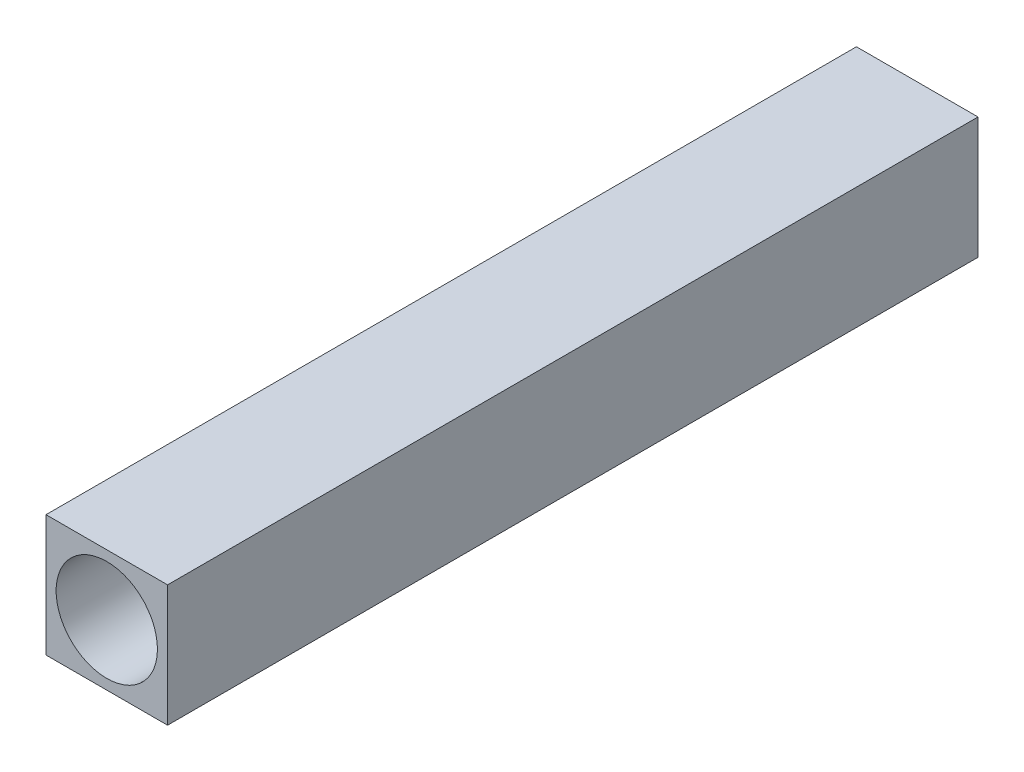
ISO-10303-21;
HEADER;
FILE_DESCRIPTION(('STEP AP214'),'2;1');
FILE_NAME('part.step','',(''),(''),'','','');
FILE_SCHEMA(('AUTOMOTIVE_DESIGN { 1 0 10303 214 1 1 1 1 }'));
ENDSEC;
DATA;
#1=APPLICATION_CONTEXT('core data for automotive mechanical design processes');
#2=APPLICATION_PROTOCOL_DEFINITION('international standard','automotive_design',2000,#1);
#3=PRODUCT_CONTEXT('',#1,'mechanical');
#4=PRODUCT('Part','Part','',(#3));
#5=PRODUCT_RELATED_PRODUCT_CATEGORY('part','',(#4));
#6=PRODUCT_DEFINITION_FORMATION('','',#4);
#7=PRODUCT_DEFINITION_CONTEXT('part definition',#1,'design');
#8=PRODUCT_DEFINITION('design','',#6,#7);
#9=PRODUCT_DEFINITION_SHAPE('','',#8);
#10=(LENGTH_UNIT() NAMED_UNIT(*) SI_UNIT(.MILLI.,.METRE.));
#11=(NAMED_UNIT(*) PLANE_ANGLE_UNIT() SI_UNIT($,.RADIAN.));
#12=(NAMED_UNIT(*) SI_UNIT($,.STERADIAN.) SOLID_ANGLE_UNIT());
#13=UNCERTAINTY_MEASURE_WITH_UNIT(LENGTH_MEASURE(1.E-05),#10,'distance_accuracy_value','');
#14=(GEOMETRIC_REPRESENTATION_CONTEXT(3) GLOBAL_UNCERTAINTY_ASSIGNED_CONTEXT((#13)) GLOBAL_UNIT_ASSIGNED_CONTEXT((#10,
#11,#12)) REPRESENTATION_CONTEXT('',''));
#15=CARTESIAN_POINT('',(0.,0.,0.));
#16=DIRECTION('',(0.,0.,1.));
#17=DIRECTION('',(1.,0.,0.));
#18=AXIS2_PLACEMENT_3D('',#15,#16,#17);
#19=CARTESIAN_POINT('',(0.,0.,100.));
#20=DIRECTION('',(0.,0.,-1.));
#21=DIRECTION('',(-1.,0.,0.));
#22=AXIS2_PLACEMENT_3D('',#19,#20,#21);
#23=PLANE('',#22);
#24=DIRECTION('',(0.,1.,0.));
#25=VECTOR('',#24,1.);
#26=CARTESIAN_POINT('',(15.,-15.,100.));
#27=LINE('',#26,#25);
#28=CARTESIAN_POINT('',(15.,-15.,100.));
#29=VERTEX_POINT('',#28);
#30=CARTESIAN_POINT('',(15.,15.,100.));
#31=VERTEX_POINT('',#30);
#32=EDGE_CURVE('E91',#29,#31,#27,.T.);
#33=ORIENTED_EDGE('',*,*,#32,.T.);
#34=DIRECTION('',(-1.,0.,0.));
#35=VECTOR('',#34,1.);
#36=CARTESIAN_POINT('',(-15.,15.,100.));
#37=LINE('',#36,#35);
#38=CARTESIAN_POINT('',(-15.,15.,100.));
#39=VERTEX_POINT('',#38);
#40=EDGE_CURVE('E87',#31,#39,#37,.T.);
#41=ORIENTED_EDGE('',*,*,#40,.T.);
#42=DIRECTION('',(0.,-1.,0.));
#43=VECTOR('',#42,1.);
#44=CARTESIAN_POINT('',(-15.,-15.,100.));
#45=LINE('',#44,#43);
#46=CARTESIAN_POINT('',(-15.,-15.,100.));
#47=VERTEX_POINT('',#46);
#48=EDGE_CURVE('E86',#39,#47,#45,.T.);
#49=ORIENTED_EDGE('',*,*,#48,.T.);
#50=DIRECTION('',(1.,0.,0.));
#51=VECTOR('',#50,1.);
#52=CARTESIAN_POINT('',(-15.,-15.,100.));
#53=LINE('',#52,#51);
#54=EDGE_CURVE('E57',#47,#29,#53,.T.);
#55=ORIENTED_EDGE('',*,*,#54,.T.);
#56=EDGE_LOOP('',(#33,#41,#49,#55));
#57=FACE_BOUND('',#56,.T.);
#58=CARTESIAN_POINT('',(0.,0.,100.));
#59=DIRECTION('',(0.,0.,1.));
#60=DIRECTION('',(1.,0.,0.));
#61=AXIS2_PLACEMENT_3D('',#58,#59,#60);
#62=CIRCLE('',#61,12.5);
#63=CARTESIAN_POINT('',(12.5,0.,100.));
#64=VERTEX_POINT('',#63);
#65=EDGE_CURVE('E108',#64,#64,#62,.T.);
#66=ORIENTED_EDGE('',*,*,#65,.F.);
#67=EDGE_LOOP('',(#66));
#68=FACE_BOUND('',#67,.T.);
#69=ADVANCED_FACE('F39',(#57,#68),#23,.F.);
#70=CARTESIAN_POINT('',(0.,0.,-100.));
#71=DIRECTION('',(0.,0.,-1.));
#72=DIRECTION('',(-1.,0.,0.));
#73=AXIS2_PLACEMENT_3D('',#70,#71,#72);
#74=PLANE('',#73);
#75=DIRECTION('',(0.,1.,0.));
#76=VECTOR('',#75,1.);
#77=CARTESIAN_POINT('',(15.,-15.,-100.));
#78=LINE('',#77,#76);
#79=CARTESIAN_POINT('',(15.,-15.,-100.));
#80=VERTEX_POINT('',#79);
#81=CARTESIAN_POINT('',(15.,15.,-100.));
#82=VERTEX_POINT('',#81);
#83=EDGE_CURVE('E104',#80,#82,#78,.T.);
#84=ORIENTED_EDGE('',*,*,#83,.F.);
#85=DIRECTION('',(1.,0.,0.));
#86=VECTOR('',#85,1.);
#87=CARTESIAN_POINT('',(-15.,-15.,-100.));
#88=LINE('',#87,#86);
#89=CARTESIAN_POINT('',(-15.,-15.,-100.));
#90=VERTEX_POINT('',#89);
#91=EDGE_CURVE('E76',#90,#80,#88,.T.);
#92=ORIENTED_EDGE('',*,*,#91,.F.);
#93=DIRECTION('',(0.,-1.,0.));
#94=VECTOR('',#93,1.);
#95=CARTESIAN_POINT('',(-15.,-15.,-100.));
#96=LINE('',#95,#94);
#97=CARTESIAN_POINT('',(-15.,15.,-100.));
#98=VERTEX_POINT('',#97);
#99=EDGE_CURVE('E73',#98,#90,#96,.T.);
#100=ORIENTED_EDGE('',*,*,#99,.F.);
#101=DIRECTION('',(-1.,0.,0.));
#102=VECTOR('',#101,1.);
#103=CARTESIAN_POINT('',(-15.,15.,-100.));
#104=LINE('',#103,#102);
#105=EDGE_CURVE('E95',#82,#98,#104,.T.);
#106=ORIENTED_EDGE('',*,*,#105,.F.);
#107=EDGE_LOOP('',(#84,#92,#100,#106));
#108=FACE_BOUND('',#107,.T.);
#109=CARTESIAN_POINT('',(0.,0.,-100.));
#110=DIRECTION('',(0.,0.,1.));
#111=DIRECTION('',(1.,0.,0.));
#112=AXIS2_PLACEMENT_3D('',#109,#110,#111);
#113=CIRCLE('',#112,12.5);
#114=CARTESIAN_POINT('',(12.5,0.,-100.));
#115=VERTEX_POINT('',#114);
#116=EDGE_CURVE('E118',#115,#115,#113,.T.);
#117=ORIENTED_EDGE('',*,*,#116,.T.);
#118=EDGE_LOOP('',(#117));
#119=FACE_BOUND('',#118,.T.);
#120=ADVANCED_FACE('F114',(#108,#119),#74,.T.);
#121=CARTESIAN_POINT('',(15.,-15.,100.));
#122=DIRECTION('',(-1.,0.,0.));
#123=DIRECTION('',(0.,0.,1.));
#124=AXIS2_PLACEMENT_3D('',#121,#122,#123);
#125=PLANE('',#124);
#126=ORIENTED_EDGE('',*,*,#83,.T.);
#127=DIRECTION('',(0.,0.,-1.));
#128=VECTOR('',#127,1.);
#129=CARTESIAN_POINT('',(15.,15.,100.));
#130=LINE('',#129,#128);
#131=EDGE_CURVE('E11',#31,#82,#130,.T.);
#132=ORIENTED_EDGE('',*,*,#131,.F.);
#133=ORIENTED_EDGE('',*,*,#32,.F.);
#134=DIRECTION('',(0.,0.,-1.));
#135=VECTOR('',#134,1.);
#136=CARTESIAN_POINT('',(15.,-15.,100.));
#137=LINE('',#136,#135);
#138=EDGE_CURVE('E97',#29,#80,#137,.T.);
#139=ORIENTED_EDGE('',*,*,#138,.T.);
#140=EDGE_LOOP('',(#126,#132,#133,#139));
#141=FACE_BOUND('',#140,.T.);
#142=ADVANCED_FACE('F41',(#141),#125,.F.);
#143=CARTESIAN_POINT('',(-15.,15.,100.));
#144=DIRECTION('',(0.,-1.,0.));
#145=DIRECTION('',(0.,0.,-1.));
#146=AXIS2_PLACEMENT_3D('',#143,#144,#145);
#147=PLANE('',#146);
#148=ORIENTED_EDGE('',*,*,#105,.T.);
#149=DIRECTION('',(0.,0.,-1.));
#150=VECTOR('',#149,1.);
#151=CARTESIAN_POINT('',(-15.,15.,100.));
#152=LINE('',#151,#150);
#153=EDGE_CURVE('E48',#39,#98,#152,.T.);
#154=ORIENTED_EDGE('',*,*,#153,.F.);
#155=ORIENTED_EDGE('',*,*,#40,.F.);
#156=ORIENTED_EDGE('',*,*,#131,.T.);
#157=EDGE_LOOP('',(#148,#154,#155,#156));
#158=FACE_BOUND('',#157,.T.);
#159=ADVANCED_FACE('F93',(#158),#147,.F.);
#160=CARTESIAN_POINT('',(-15.,-15.,100.));
#161=DIRECTION('',(1.,0.,0.));
#162=DIRECTION('',(0.,0.,-1.));
#163=AXIS2_PLACEMENT_3D('',#160,#161,#162);
#164=PLANE('',#163);
#165=ORIENTED_EDGE('',*,*,#99,.T.);
#166=DIRECTION('',(0.,0.,-1.));
#167=VECTOR('',#166,1.);
#168=CARTESIAN_POINT('',(-15.,-15.,100.));
#169=LINE('',#168,#167);
#170=EDGE_CURVE('E96',#47,#90,#169,.T.);
#171=ORIENTED_EDGE('',*,*,#170,.F.);
#172=ORIENTED_EDGE('',*,*,#48,.F.);
#173=ORIENTED_EDGE('',*,*,#153,.T.);
#174=EDGE_LOOP('',(#165,#171,#172,#173));
#175=FACE_BOUND('',#174,.T.);
#176=ADVANCED_FACE('F100',(#175),#164,.F.);
#177=CARTESIAN_POINT('',(-15.,-15.,100.));
#178=DIRECTION('',(0.,1.,0.));
#179=DIRECTION('',(0.,0.,1.));
#180=AXIS2_PLACEMENT_3D('',#177,#178,#179);
#181=PLANE('',#180);
#182=ORIENTED_EDGE('',*,*,#91,.T.);
#183=ORIENTED_EDGE('',*,*,#138,.F.);
#184=ORIENTED_EDGE('',*,*,#54,.F.);
#185=ORIENTED_EDGE('',*,*,#170,.T.);
#186=EDGE_LOOP('',(#182,#183,#184,#185));
#187=FACE_BOUND('',#186,.T.);
#188=ADVANCED_FACE('F113',(#187),#181,.F.);
#189=CARTESIAN_POINT('',(0.,0.,100.));
#190=DIRECTION('',(0.,0.,-1.));
#191=DIRECTION('',(-1.,0.,0.));
#192=AXIS2_PLACEMENT_3D('',#189,#190,#191);
#193=CYLINDRICAL_SURFACE('',#192,12.5);
#194=ORIENTED_EDGE('',*,*,#65,.T.);
#195=EDGE_LOOP('',(#194));
#196=FACE_BOUND('',#195,.T.);
#197=ORIENTED_EDGE('',*,*,#116,.F.);
#198=EDGE_LOOP('',(#197));
#199=FACE_BOUND('',#198,.T.);
#200=ADVANCED_FACE('F122',(#196,#199),#193,.F.);
#201=CLOSED_SHELL('',(#69,#120,#142,#159,#176,#188,#200));
#202=MANIFOLD_SOLID_BREP('B2',#201);
#203=ADVANCED_BREP_SHAPE_REPRESENTATION('',(#18,#202),#14);
#204=SHAPE_DEFINITION_REPRESENTATION(#9,#203);
ENDSEC;
END-ISO-10303-21;
